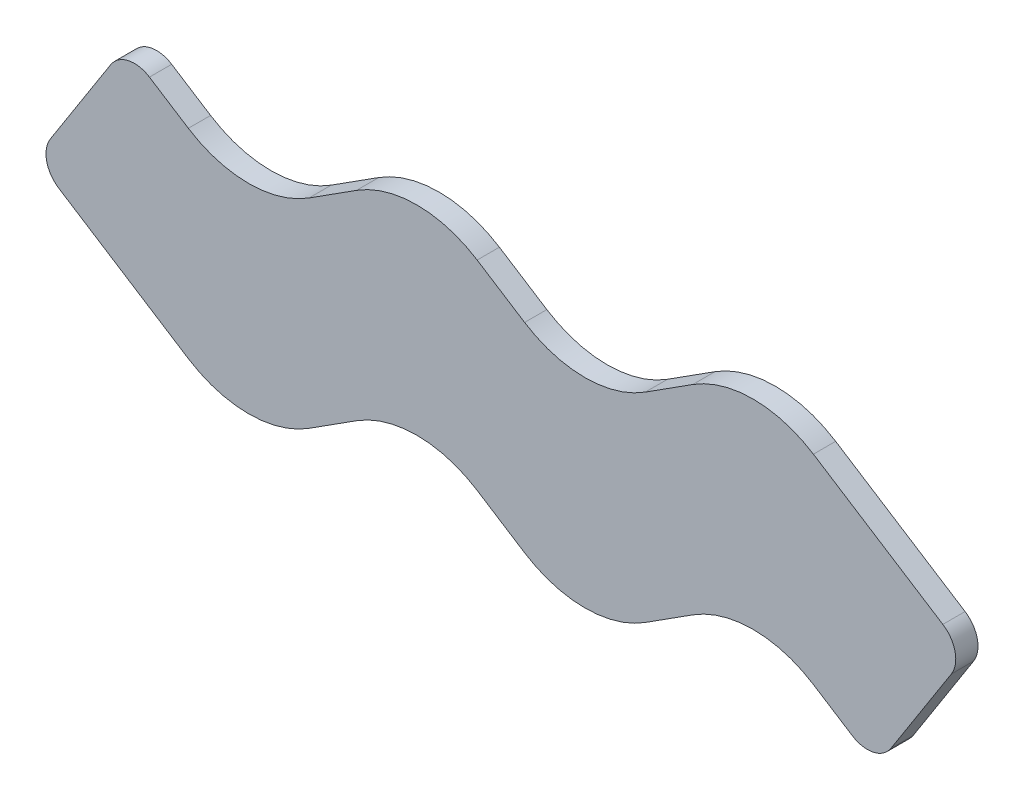
ISO-10303-21;
HEADER;
FILE_DESCRIPTION(('STEP AP214'),'2;1');
FILE_NAME('part.step','',(''),(''),'','','');
FILE_SCHEMA(('AUTOMOTIVE_DESIGN { 1 0 10303 214 1 1 1 1 }'));
ENDSEC;
DATA;
#1=APPLICATION_CONTEXT('core data for automotive mechanical design processes');
#2=APPLICATION_PROTOCOL_DEFINITION('international standard','automotive_design',2000,#1);
#3=PRODUCT_CONTEXT('',#1,'mechanical');
#4=PRODUCT('Part','Part','',(#3));
#5=PRODUCT_RELATED_PRODUCT_CATEGORY('part','',(#4));
#6=PRODUCT_DEFINITION_FORMATION('','',#4);
#7=PRODUCT_DEFINITION_CONTEXT('part definition',#1,'design');
#8=PRODUCT_DEFINITION('design','',#6,#7);
#9=PRODUCT_DEFINITION_SHAPE('','',#8);
#10=(LENGTH_UNIT() NAMED_UNIT(*) SI_UNIT(.MILLI.,.METRE.));
#11=(NAMED_UNIT(*) PLANE_ANGLE_UNIT() SI_UNIT($,.RADIAN.));
#12=(NAMED_UNIT(*) SI_UNIT($,.STERADIAN.) SOLID_ANGLE_UNIT());
#13=UNCERTAINTY_MEASURE_WITH_UNIT(LENGTH_MEASURE(1.E-05),#10,'distance_accuracy_value','');
#14=(GEOMETRIC_REPRESENTATION_CONTEXT(3) GLOBAL_UNCERTAINTY_ASSIGNED_CONTEXT((#13)) GLOBAL_UNIT_ASSIGNED_CONTEXT((#10,
#11,#12)) REPRESENTATION_CONTEXT('',''));
#15=CARTESIAN_POINT('',(0.,0.,0.));
#16=DIRECTION('',(0.,0.,1.));
#17=DIRECTION('',(1.,0.,0.));
#18=AXIS2_PLACEMENT_3D('',#15,#16,#17);
#19=CARTESIAN_POINT('',(8.42171922425703,-13.1818213944893,1.5875));
#20=DIRECTION('',(-0.5383892771022,0.84269625981214,0.));
#21=DIRECTION('',(-0.84269625981214,-0.5383892771022,0.));
#22=AXIS2_PLACEMENT_3D('',#19,#20,#21);
#23=PLANE('',#22);
#24=DIRECTION('',(0.84269625981214,0.5383892771022,0.));
#25=VECTOR('',#24,1.);
#26=CARTESIAN_POINT('',(8.42171922425703,-13.1818213944893,0.));
#27=LINE('',#26,#25);
#28=CARTESIAN_POINT('',(51.0821142168176,14.0734309618689,0.));
#29=VERTEX_POINT('',#28);
#30=CARTESIAN_POINT('',(54.4678857831824,16.2365627959353,0.));
#31=VERTEX_POINT('',#30);
#32=EDGE_CURVE('E400',#29,#31,#27,.T.);
#33=ORIENTED_EDGE('',*,*,#32,.T.);
#34=DIRECTION('',(0.,0.,-1.));
#35=VECTOR('',#34,1.);
#36=CARTESIAN_POINT('',(54.4678857831824,16.2365627959353,1.5875));
#37=LINE('',#36,#35);
#38=CARTESIAN_POINT('',(54.4678857831824,16.2365627959353,1.5875));
#39=VERTEX_POINT('',#38);
#40=EDGE_CURVE('E310',#31,#39,#37,.F.);
#41=ORIENTED_EDGE('',*,*,#40,.T.);
#42=DIRECTION('',(0.84269625981214,0.5383892771022,0.));
#43=VECTOR('',#42,1.);
#44=CARTESIAN_POINT('',(8.42171922425703,-13.1818213944893,1.5875));
#45=LINE('',#44,#43);
#46=CARTESIAN_POINT('',(51.0821142168176,14.0734309618689,1.5875));
#47=VERTEX_POINT('',#46);
#48=EDGE_CURVE('E376',#47,#39,#45,.T.);
#49=ORIENTED_EDGE('',*,*,#48,.F.);
#50=DIRECTION('',(0.,0.,-1.));
#51=VECTOR('',#50,1.);
#52=CARTESIAN_POINT('',(51.0821142168176,14.0734309618689,0.));
#53=LINE('',#52,#51);
#54=EDGE_CURVE('E291',#47,#29,#53,.T.);
#55=ORIENTED_EDGE('',*,*,#54,.T.);
#56=EDGE_LOOP('',(#33,#41,#49,#55));
#57=FACE_BOUND('',#56,.T.);
#58=ADVANCED_FACE('F41',(#57),#23,.F.);
#59=CARTESIAN_POINT('',(25.651678036017,40.1504525781135,1.5875));
#60=DIRECTION('',(0.538389277102201,0.84269625981214,0.));
#61=DIRECTION('',(-0.84269625981214,0.538389277102201,0.));
#62=AXIS2_PLACEMENT_3D('',#59,#60,#61);
#63=PLANE('',#62);
#64=DIRECTION('',(0.84269625981214,-0.538389277102201,0.));
#65=VECTOR('',#64,1.);
#66=CARTESIAN_POINT('',(25.651678036017,40.1504525781135,1.5875));
#67=LINE('',#66,#65);
#68=CARTESIAN_POINT('',(63.0821142168176,16.2365627959352,1.5875));
#69=VERTEX_POINT('',#68);
#70=CARTESIAN_POINT('',(65.8592718177625,14.4622676619982,1.5875));
#71=VERTEX_POINT('',#70);
#72=EDGE_CURVE('E379',#69,#71,#67,.T.);
#73=ORIENTED_EDGE('',*,*,#72,.F.);
#74=DIRECTION('',(0.,0.,-1.));
#75=VECTOR('',#74,1.);
#76=CARTESIAN_POINT('',(63.0821142168176,16.2365627959353,0.));
#77=LINE('',#76,#75);
#78=CARTESIAN_POINT('',(63.0821142168176,16.2365627959352,0.));
#79=VERTEX_POINT('',#78);
#80=EDGE_CURVE('E307',#69,#79,#77,.T.);
#81=ORIENTED_EDGE('',*,*,#80,.T.);
#82=DIRECTION('',(0.84269625981214,-0.538389277102201,0.));
#83=VECTOR('',#82,1.);
#84=CARTESIAN_POINT('',(25.651678036017,40.1504525781135,0.));
#85=LINE('',#84,#83);
#86=CARTESIAN_POINT('',(65.8592718177625,14.4622676619982,0.));
#87=VERTEX_POINT('',#86);
#88=EDGE_CURVE('E403',#79,#87,#85,.T.);
#89=ORIENTED_EDGE('',*,*,#88,.T.);
#90=DIRECTION('',(0.,0.,-1.));
#91=VECTOR('',#90,1.);
#92=CARTESIAN_POINT('',(65.8592718177625,14.4622676619982,1.5875));
#93=LINE('',#92,#91);
#94=EDGE_CURVE('E261',#87,#71,#93,.F.);
#95=ORIENTED_EDGE('',*,*,#94,.T.);
#96=EDGE_LOOP('',(#73,#81,#89,#95));
#97=FACE_BOUND('',#96,.T.);
#98=ADVANCED_FACE('F425',(#97),#63,.F.);
#99=CARTESIAN_POINT('',(41.8929863013699,-26.7649634703196,1.5875));
#100=DIRECTION('',(-0.84269625981214,0.5383892771022,0.));
#101=DIRECTION('',(-0.5383892771022,-0.84269625981214,0.));
#102=AXIS2_PLACEMENT_3D('',#99,#100,#101);
#103=PLANE('',#102);
#104=DIRECTION('',(0.5383892771022,0.84269625981214,0.));
#105=VECTOR('',#104,1.);
#106=CARTESIAN_POINT('',(41.8929863013699,-26.7649634703196,1.5875));
#107=LINE('',#106,#105);
#108=CARTESIAN_POINT('',(68.6214428915912,15.0708816274181,1.5875));
#109=VERTEX_POINT('',#108);
#110=CARTESIAN_POINT('',(72.9285571084088,21.8124517059152,1.5875));
#111=VERTEX_POINT('',#110);
#112=EDGE_CURVE('E383',#109,#111,#107,.T.);
#113=ORIENTED_EDGE('',*,*,#112,.F.);
#114=DIRECTION('',(0.,0.,-1.));
#115=VECTOR('',#114,1.);
#116=CARTESIAN_POINT('',(68.6214428915912,15.0708816274181,1.5875));
#117=LINE('',#116,#115);
#118=CARTESIAN_POINT('',(68.6214428915912,15.0708816274181,0.));
#119=VERTEX_POINT('',#118);
#120=EDGE_CURVE('E258',#109,#119,#117,.T.);
#121=ORIENTED_EDGE('',*,*,#120,.T.);
#122=DIRECTION('',(0.5383892771022,0.84269625981214,0.));
#123=VECTOR('',#122,1.);
#124=CARTESIAN_POINT('',(41.8929863013699,-26.7649634703196,0.));
#125=LINE('',#124,#123);
#126=CARTESIAN_POINT('',(72.9285571084088,21.8124517059152,0.));
#127=VERTEX_POINT('',#126);
#128=EDGE_CURVE('E366',#119,#127,#125,.T.);
#129=ORIENTED_EDGE('',*,*,#128,.T.);
#130=DIRECTION('',(0.,0.,-1.));
#131=VECTOR('',#130,1.);
#132=CARTESIAN_POINT('',(72.9285571084088,21.8124517059152,1.5875));
#133=LINE('',#132,#131);
#134=EDGE_CURVE('E256',#127,#111,#133,.F.);
#135=ORIENTED_EDGE('',*,*,#134,.T.);
#136=EDGE_LOOP('',(#113,#121,#129,#135));
#137=FACE_BOUND('',#136,.T.);
#138=ADVANCED_FACE('F409',(#137),#103,.F.);
#139=CARTESIAN_POINT('',(32.1123493612434,50.2628076958591,1.5875));
#140=DIRECTION('',(0.538389277102201,0.84269625981214,0.));
#141=DIRECTION('',(-0.84269625981214,0.538389277102201,0.));
#142=AXIS2_PLACEMENT_3D('',#139,#140,#141);
#143=PLANE('',#142);
#144=DIRECTION('',(0.84269625981214,-0.538389277102201,0.));
#145=VECTOR('',#144,1.);
#146=CARTESIAN_POINT('',(32.1123493612434,50.2628076958591,0.));
#147=LINE('',#146,#145);
#148=CARTESIAN_POINT('',(63.0821142168176,30.4765690381311,0.));
#149=VERTEX_POINT('',#148);
#150=CARTESIAN_POINT('',(72.3199431429889,24.5746227797439,0.));
#151=VERTEX_POINT('',#150);
#152=EDGE_CURVE('E362',#149,#151,#147,.T.);
#153=ORIENTED_EDGE('',*,*,#152,.F.);
#154=DIRECTION('',(0.,0.,-1.));
#155=VECTOR('',#154,1.);
#156=CARTESIAN_POINT('',(63.0821142168176,30.4765690381311,1.5875));
#157=LINE('',#156,#155);
#158=CARTESIAN_POINT('',(63.0821142168176,30.4765690381311,1.5875));
#159=VERTEX_POINT('',#158);
#160=EDGE_CURVE('E279',#149,#159,#157,.F.);
#161=ORIENTED_EDGE('',*,*,#160,.T.);
#162=DIRECTION('',(0.84269625981214,-0.538389277102201,0.));
#163=VECTOR('',#162,1.);
#164=CARTESIAN_POINT('',(32.1123493612434,50.2628076958591,1.5875));
#165=LINE('',#164,#163);
#166=CARTESIAN_POINT('',(72.3199431429889,24.5746227797439,1.5875));
#167=VERTEX_POINT('',#166);
#168=EDGE_CURVE('E388',#159,#167,#165,.T.);
#169=ORIENTED_EDGE('',*,*,#168,.T.);
#170=DIRECTION('',(0.,0.,-1.));
#171=VECTOR('',#170,1.);
#172=CARTESIAN_POINT('',(72.3199431429889,24.5746227797439,0.));
#173=LINE('',#172,#171);
#174=EDGE_CURVE('E264',#167,#151,#173,.T.);
#175=ORIENTED_EDGE('',*,*,#174,.T.);
#176=EDGE_LOOP('',(#153,#161,#169,#175));
#177=FACE_BOUND('',#176,.T.);
#178=ADVANCED_FACE('F502',(#177),#143,.T.);
#179=CARTESIAN_POINT('',(1.96104789903067,-3.06946627674365,1.5875));
#180=DIRECTION('',(-0.538389277102202,0.84269625981214,0.));
#181=DIRECTION('',(-0.84269625981214,-0.538389277102202,0.));
#182=AXIS2_PLACEMENT_3D('',#179,#180,#181);
#183=PLANE('',#182);
#184=DIRECTION('',(0.842696259812139,0.538389277102201,0.));
#185=VECTOR('',#184,1.);
#186=CARTESIAN_POINT('',(1.96104789903067,-3.06946627674365,0.));
#187=LINE('',#186,#185);
#188=CARTESIAN_POINT('',(51.0821142168176,28.3134372040647,0.));
#189=VERTEX_POINT('',#188);
#190=CARTESIAN_POINT('',(54.4678857831824,30.4765690381311,0.));
#191=VERTEX_POINT('',#190);
#192=EDGE_CURVE('E356',#189,#191,#187,.T.);
#193=ORIENTED_EDGE('',*,*,#192,.F.);
#194=DIRECTION('',(0.,0.,-1.));
#195=VECTOR('',#194,1.);
#196=CARTESIAN_POINT('',(51.0821142168176,28.3134372040647,1.5875));
#197=LINE('',#196,#195);
#198=CARTESIAN_POINT('',(51.0821142168176,28.3134372040647,1.5875));
#199=VERTEX_POINT('',#198);
#200=EDGE_CURVE('E320',#189,#199,#197,.F.);
#201=ORIENTED_EDGE('',*,*,#200,.T.);
#202=DIRECTION('',(0.842696259812139,0.538389277102201,0.));
#203=VECTOR('',#202,1.);
#204=CARTESIAN_POINT('',(1.96104789903067,-3.06946627674365,1.5875));
#205=LINE('',#204,#203);
#206=CARTESIAN_POINT('',(54.4678857831824,30.4765690381311,1.5875));
#207=VERTEX_POINT('',#206);
#208=EDGE_CURVE('E344',#199,#207,#205,.T.);
#209=ORIENTED_EDGE('',*,*,#208,.T.);
#210=DIRECTION('',(0.,0.,-1.));
#211=VECTOR('',#210,1.);
#212=CARTESIAN_POINT('',(54.4678857831824,30.4765690381311,1.5875));
#213=LINE('',#212,#211);
#214=EDGE_CURVE('E267',#207,#191,#213,.T.);
#215=ORIENTED_EDGE('',*,*,#214,.T.);
#216=EDGE_LOOP('',(#193,#201,#209,#215));
#217=FACE_BOUND('',#216,.T.);
#218=ADVANCED_FACE('F360',(#217),#183,.T.);
#219=CARTESIAN_POINT('',(25.1556370324762,39.3740405725715,1.5875));
#220=DIRECTION('',(-0.538389277102201,-0.84269625981214,0.));
#221=DIRECTION('',(0.84269625981214,-0.538389277102201,0.));
#222=AXIS2_PLACEMENT_3D('',#219,#220,#221);
#223=PLANE('',#222);
#224=DIRECTION('',(-0.84269625981214,0.538389277102201,0.));
#225=VECTOR('',#224,1.);
#226=CARTESIAN_POINT('',(25.1556370324762,39.3740405725715,1.5875));
#227=LINE('',#226,#225);
#228=CARTESIAN_POINT('',(42.4678857831824,28.3134372040647,1.5875));
#229=VERTEX_POINT('',#228);
#230=CARTESIAN_POINT('',(39.0821142168176,30.4765690381311,1.5875));
#231=VERTEX_POINT('',#230);
#232=EDGE_CURVE('E343',#229,#231,#227,.T.);
#233=ORIENTED_EDGE('',*,*,#232,.F.);
#234=DIRECTION('',(0.,0.,-1.));
#235=VECTOR('',#234,1.);
#236=CARTESIAN_POINT('',(42.4678857831824,28.3134372040647,1.5875));
#237=LINE('',#236,#235);
#238=CARTESIAN_POINT('',(42.4678857831824,28.3134372040647,0.));
#239=VERTEX_POINT('',#238);
#240=EDGE_CURVE('E317',#229,#239,#237,.T.);
#241=ORIENTED_EDGE('',*,*,#240,.T.);
#242=DIRECTION('',(-0.84269625981214,0.538389277102201,0.));
#243=VECTOR('',#242,1.);
#244=CARTESIAN_POINT('',(25.1556370324762,39.3740405725715,0.));
#245=LINE('',#244,#243);
#246=CARTESIAN_POINT('',(39.0821142168176,30.4765690381311,0.));
#247=VERTEX_POINT('',#246);
#248=EDGE_CURVE('E358',#239,#247,#245,.T.);
#249=ORIENTED_EDGE('',*,*,#248,.T.);
#250=DIRECTION('',(0.,0.,-1.));
#251=VECTOR('',#250,1.);
#252=CARTESIAN_POINT('',(39.0821142168176,30.4765690381311,1.5875));
#253=LINE('',#252,#251);
#254=EDGE_CURVE('E299',#247,#231,#253,.F.);
#255=ORIENTED_EDGE('',*,*,#254,.T.);
#256=EDGE_LOOP('',(#233,#241,#249,#255));
#257=FACE_BOUND('',#256,.T.);
#258=ADVANCED_FACE('F349',(#257),#223,.F.);
#259=CARTESIAN_POINT('',(-4.99566442973648,7.81930084654405,1.5875));
#260=DIRECTION('',(0.538389277102201,-0.84269625981214,0.));
#261=DIRECTION('',(0.84269625981214,0.538389277102201,0.));
#262=AXIS2_PLACEMENT_3D('',#259,#260,#261);
#263=PLANE('',#262);
#264=DIRECTION('',(-0.84269625981214,-0.538389277102201,0.));
#265=VECTOR('',#264,1.);
#266=CARTESIAN_POINT('',(-4.99566442973648,7.81930084654405,0.));
#267=LINE('',#266,#265);
#268=CARTESIAN_POINT('',(30.4678857831824,30.4765690381311,0.));
#269=VERTEX_POINT('',#268);
#270=CARTESIAN_POINT('',(27.0821142168176,28.3134372040647,0.));
#271=VERTEX_POINT('',#270);
#272=EDGE_CURVE('E364',#269,#271,#267,.T.);
#273=ORIENTED_EDGE('',*,*,#272,.T.);
#274=DIRECTION('',(0.,0.,-1.));
#275=VECTOR('',#274,1.);
#276=CARTESIAN_POINT('',(27.0821142168176,28.3134372040647,1.5875));
#277=LINE('',#276,#275);
#278=CARTESIAN_POINT('',(27.0821142168176,28.3134372040647,1.5875));
#279=VERTEX_POINT('',#278);
#280=EDGE_CURVE('E62',#271,#279,#277,.F.);
#281=ORIENTED_EDGE('',*,*,#280,.T.);
#282=DIRECTION('',(-0.84269625981214,-0.538389277102201,0.));
#283=VECTOR('',#282,1.);
#284=CARTESIAN_POINT('',(-4.99566442973648,7.81930084654405,1.5875));
#285=LINE('',#284,#283);
#286=CARTESIAN_POINT('',(30.4678857831824,30.4765690381311,1.5875));
#287=VERTEX_POINT('',#286);
#288=EDGE_CURVE('E352',#287,#279,#285,.T.);
#289=ORIENTED_EDGE('',*,*,#288,.F.);
#290=DIRECTION('',(0.,0.,-1.));
#291=VECTOR('',#290,1.);
#292=CARTESIAN_POINT('',(30.4678857831824,30.4765690381311,1.5875));
#293=LINE('',#292,#291);
#294=EDGE_CURVE('E296',#287,#269,#293,.T.);
#295=ORIENTED_EDGE('',*,*,#294,.T.);
#296=EDGE_LOOP('',(#273,#281,#289,#295));
#297=FACE_BOUND('',#296,.T.);
#298=ADVANCED_FACE('F467',(#297),#263,.F.);
#299=CARTESIAN_POINT('',(18.1989247037092,28.4852734492838,1.5875));
#300=DIRECTION('',(0.538389277102202,0.842696259812139,0.));
#301=DIRECTION('',(-0.842696259812139,0.538389277102202,0.));
#302=AXIS2_PLACEMENT_3D('',#299,#300,#301);
#303=PLANE('',#302);
#304=DIRECTION('',(0.842696259812139,-0.538389277102202,0.));
#305=VECTOR('',#304,1.);
#306=CARTESIAN_POINT('',(18.1989247037092,28.4852734492838,1.5875));
#307=LINE('',#306,#305);
#308=CARTESIAN_POINT('',(15.6907281822375,30.0877323380018,1.5875));
#309=VERTEX_POINT('',#308);
#310=CARTESIAN_POINT('',(18.4678857831824,28.3134372040648,1.5875));
#311=VERTEX_POINT('',#310);
#312=EDGE_CURVE('E392',#309,#311,#307,.T.);
#313=ORIENTED_EDGE('',*,*,#312,.T.);
#314=DIRECTION('',(0.,0.,-1.));
#315=VECTOR('',#314,1.);
#316=CARTESIAN_POINT('',(18.4678857831824,28.3134372040648,1.5875));
#317=LINE('',#316,#315);
#318=CARTESIAN_POINT('',(18.4678857831824,28.3134372040648,0.));
#319=VERTEX_POINT('',#318);
#320=EDGE_CURVE('E322',#311,#319,#317,.T.);
#321=ORIENTED_EDGE('',*,*,#320,.T.);
#322=DIRECTION('',(0.842696259812139,-0.538389277102202,0.));
#323=VECTOR('',#322,1.);
#324=CARTESIAN_POINT('',(18.1989247037092,28.4852734492838,0.));
#325=LINE('',#324,#323);
#326=CARTESIAN_POINT('',(15.6907281822375,30.0877323380018,0.));
#327=VERTEX_POINT('',#326);
#328=EDGE_CURVE('E223',#327,#319,#325,.T.);
#329=ORIENTED_EDGE('',*,*,#328,.F.);
#330=DIRECTION('',(0.,0.,-1.));
#331=VECTOR('',#330,1.);
#332=CARTESIAN_POINT('',(15.6907281822375,30.0877323380018,1.5875));
#333=LINE('',#332,#331);
#334=EDGE_CURVE('E244',#327,#309,#333,.F.);
#335=ORIENTED_EDGE('',*,*,#334,.T.);
#336=EDGE_LOOP('',(#313,#321,#329,#335));
#337=FACE_BOUND('',#336,.T.);
#338=ADVANCED_FACE('F462',(#337),#303,.T.);
#339=CARTESIAN_POINT('',(-4.19358904109588,2.67923744292237,1.5875));
#340=DIRECTION('',(-0.84269625981214,0.5383892771022,0.));
#341=DIRECTION('',(-0.5383892771022,-0.84269625981214,0.));
#342=AXIS2_PLACEMENT_3D('',#339,#340,#341);
#343=PLANE('',#342);
#344=DIRECTION('',(0.5383892771022,0.84269625981214,0.));
#345=VECTOR('',#344,1.);
#346=CARTESIAN_POINT('',(-4.19358904109588,2.67923744292237,1.5875));
#347=LINE('',#346,#345);
#348=CARTESIAN_POINT('',(8.6214428915912,22.7375482940848,1.5875));
#349=VERTEX_POINT('',#348);
#350=CARTESIAN_POINT('',(12.9285571084088,29.4791183725819,1.5875));
#351=VERTEX_POINT('',#350);
#352=EDGE_CURVE('E395',#349,#351,#347,.T.);
#353=ORIENTED_EDGE('',*,*,#352,.T.);
#354=DIRECTION('',(0.,0.,-1.));
#355=VECTOR('',#354,1.);
#356=CARTESIAN_POINT('',(12.9285571084088,29.4791183725819,1.5875));
#357=LINE('',#356,#355);
#358=CARTESIAN_POINT('',(12.9285571084088,29.4791183725819,0.));
#359=VERTEX_POINT('',#358);
#360=EDGE_CURVE('E222',#351,#359,#357,.T.);
#361=ORIENTED_EDGE('',*,*,#360,.T.);
#362=DIRECTION('',(0.5383892771022,0.84269625981214,0.));
#363=VECTOR('',#362,1.);
#364=CARTESIAN_POINT('',(-4.19358904109588,2.67923744292237,0.));
#365=LINE('',#364,#363);
#366=CARTESIAN_POINT('',(8.6214428915912,22.7375482940848,0.));
#367=VERTEX_POINT('',#366);
#368=EDGE_CURVE('E205',#367,#359,#365,.T.);
#369=ORIENTED_EDGE('',*,*,#368,.F.);
#370=DIRECTION('',(0.,0.,-1.));
#371=VECTOR('',#370,1.);
#372=CARTESIAN_POINT('',(8.6214428915912,22.7375482940848,1.5875));
#373=LINE('',#372,#371);
#374=EDGE_CURVE('E219',#367,#349,#373,.F.);
#375=ORIENTED_EDGE('',*,*,#374,.T.);
#376=EDGE_LOOP('',(#353,#361,#369,#375));
#377=FACE_BOUND('',#376,.T.);
#378=ADVANCED_FACE('F218',(#377),#343,.T.);
#379=CARTESIAN_POINT('',(11.7382533784827,18.3729183315381,1.5875));
#380=DIRECTION('',(-0.5383892771022,-0.84269625981214,0.));
#381=DIRECTION('',(0.84269625981214,-0.5383892771022,0.));
#382=AXIS2_PLACEMENT_3D('',#379,#380,#381);
#383=PLANE('',#382);
#384=DIRECTION('',(-0.84269625981214,0.5383892771022,0.));
#385=VECTOR('',#384,1.);
#386=CARTESIAN_POINT('',(11.7382533784827,18.3729183315381,0.));
#387=LINE('',#386,#385);
#388=CARTESIAN_POINT('',(18.4678857831824,14.0734309618689,0.));
#389=VERTEX_POINT('',#388);
#390=CARTESIAN_POINT('',(9.23005685701108,19.9753772202561,0.));
#391=VERTEX_POINT('',#390);
#392=EDGE_CURVE('E207',#389,#391,#387,.T.);
#393=ORIENTED_EDGE('',*,*,#392,.F.);
#394=DIRECTION('',(0.,0.,-1.));
#395=VECTOR('',#394,1.);
#396=CARTESIAN_POINT('',(18.4678857831824,14.0734309618689,1.5875));
#397=LINE('',#396,#395);
#398=CARTESIAN_POINT('',(18.4678857831824,14.0734309618689,1.5875));
#399=VERTEX_POINT('',#398);
#400=EDGE_CURVE('E305',#389,#399,#397,.F.);
#401=ORIENTED_EDGE('',*,*,#400,.T.);
#402=DIRECTION('',(-0.84269625981214,0.5383892771022,0.));
#403=VECTOR('',#402,1.);
#404=CARTESIAN_POINT('',(11.7382533784827,18.3729183315381,1.5875));
#405=LINE('',#404,#403);
#406=CARTESIAN_POINT('',(9.23005685701108,19.9753772202561,1.5875));
#407=VERTEX_POINT('',#406);
#408=EDGE_CURVE('E397',#399,#407,#405,.T.);
#409=ORIENTED_EDGE('',*,*,#408,.T.);
#410=DIRECTION('',(0.,0.,-1.));
#411=VECTOR('',#410,1.);
#412=CARTESIAN_POINT('',(9.23005685701108,19.9753772202561,1.5875));
#413=LINE('',#412,#411);
#414=EDGE_CURVE('E254',#407,#391,#413,.T.);
#415=ORIENTED_EDGE('',*,*,#414,.T.);
#416=EDGE_LOOP('',(#393,#401,#409,#415));
#417=FACE_BOUND('',#416,.T.);
#418=ADVANCED_FACE('F453',(#417),#383,.T.);
#419=CARTESIAN_POINT('',(1.46500689548992,-2.29305427120162,1.5875));
#420=DIRECTION('',(0.538389277102201,-0.84269625981214,0.));
#421=DIRECTION('',(0.84269625981214,0.538389277102201,0.));
#422=AXIS2_PLACEMENT_3D('',#419,#420,#421);
#423=PLANE('',#422);
#424=DIRECTION('',(-0.84269625981214,-0.538389277102201,0.));
#425=VECTOR('',#424,1.);
#426=CARTESIAN_POINT('',(1.46500689548992,-2.29305427120162,0.));
#427=LINE('',#426,#425);
#428=CARTESIAN_POINT('',(30.4678857831824,16.2365627959352,0.));
#429=VERTEX_POINT('',#428);
#430=CARTESIAN_POINT('',(27.0821142168176,14.0734309618689,0.));
#431=VERTEX_POINT('',#430);
#432=EDGE_CURVE('E372',#429,#431,#427,.T.);
#433=ORIENTED_EDGE('',*,*,#432,.F.);
#434=DIRECTION('',(0.,0.,-1.));
#435=VECTOR('',#434,1.);
#436=CARTESIAN_POINT('',(30.4678857831824,16.2365627959352,1.5875));
#437=LINE('',#436,#435);
#438=CARTESIAN_POINT('',(30.4678857831824,16.2365627959352,1.5875));
#439=VERTEX_POINT('',#438);
#440=EDGE_CURVE('E315',#429,#439,#437,.F.);
#441=ORIENTED_EDGE('',*,*,#440,.T.);
#442=DIRECTION('',(-0.84269625981214,-0.538389277102201,0.));
#443=VECTOR('',#442,1.);
#444=CARTESIAN_POINT('',(1.46500689548992,-2.29305427120162,1.5875));
#445=LINE('',#444,#443);
#446=CARTESIAN_POINT('',(27.0821142168176,14.0734309618689,1.5875));
#447=VERTEX_POINT('',#446);
#448=EDGE_CURVE('E234',#439,#447,#445,.T.);
#449=ORIENTED_EDGE('',*,*,#448,.T.);
#450=DIRECTION('',(0.,0.,-1.));
#451=VECTOR('',#450,1.);
#452=CARTESIAN_POINT('',(27.0821142168176,14.0734309618689,1.5875));
#453=LINE('',#452,#451);
#454=EDGE_CURVE('E302',#447,#431,#453,.T.);
#455=ORIENTED_EDGE('',*,*,#454,.T.);
#456=EDGE_LOOP('',(#433,#441,#449,#455));
#457=FACE_BOUND('',#456,.T.);
#458=ADVANCED_FACE('F446',(#457),#423,.T.);
#459=CARTESIAN_POINT('',(18.6949657072498,29.2616854548258,1.5875));
#460=DIRECTION('',(-0.538389277102201,-0.84269625981214,0.));
#461=DIRECTION('',(0.84269625981214,-0.538389277102201,0.));
#462=AXIS2_PLACEMENT_3D('',#459,#460,#461);
#463=PLANE('',#462);
#464=DIRECTION('',(-0.84269625981214,0.538389277102201,0.));
#465=VECTOR('',#464,1.);
#466=CARTESIAN_POINT('',(18.6949657072498,29.2616854548258,1.5875));
#467=LINE('',#466,#465);
#468=CARTESIAN_POINT('',(42.4678857831824,14.0734309618688,1.5875));
#469=VERTEX_POINT('',#468);
#470=CARTESIAN_POINT('',(39.0821142168176,16.2365627959352,1.5875));
#471=VERTEX_POINT('',#470);
#472=EDGE_CURVE('E229',#469,#471,#467,.T.);
#473=ORIENTED_EDGE('',*,*,#472,.T.);
#474=DIRECTION('',(0.,0.,-1.));
#475=VECTOR('',#474,1.);
#476=CARTESIAN_POINT('',(39.0821142168176,16.2365627959352,0.));
#477=LINE('',#476,#475);
#478=CARTESIAN_POINT('',(39.0821142168176,16.2365627959352,0.));
#479=VERTEX_POINT('',#478);
#480=EDGE_CURVE('E312',#471,#479,#477,.T.);
#481=ORIENTED_EDGE('',*,*,#480,.T.);
#482=DIRECTION('',(-0.84269625981214,0.538389277102201,0.));
#483=VECTOR('',#482,1.);
#484=CARTESIAN_POINT('',(18.6949657072498,29.2616854548258,0.));
#485=LINE('',#484,#483);
#486=CARTESIAN_POINT('',(42.4678857831824,14.0734309618688,0.));
#487=VERTEX_POINT('',#486);
#488=EDGE_CURVE('E237',#487,#479,#485,.T.);
#489=ORIENTED_EDGE('',*,*,#488,.F.);
#490=DIRECTION('',(0.,0.,-1.));
#491=VECTOR('',#490,1.);
#492=CARTESIAN_POINT('',(42.4678857831824,14.0734309618688,1.5875));
#493=LINE('',#492,#491);
#494=EDGE_CURVE('E294',#487,#469,#493,.F.);
#495=ORIENTED_EDGE('',*,*,#494,.T.);
#496=EDGE_LOOP('',(#473,#481,#489,#495));
#497=FACE_BOUND('',#496,.T.);
#498=ADVANCED_FACE('F435',(#497),#463,.T.);
#499=CARTESIAN_POINT('',(0.,0.,1.5875));
#500=DIRECTION('',(0.,0.,1.));
#501=DIRECTION('',(1.,0.,0.));
#502=AXIS2_PLACEMENT_3D('',#499,#500,#501);
#503=PLANE('',#502);
#504=ORIENTED_EDGE('',*,*,#168,.F.);
#505=CARTESIAN_POINT('',(58.775,23.734998959634,1.5875));
#506=DIRECTION('',(0.,0.,1.));
#507=DIRECTION('',(1.,0.,0.));
#508=AXIS2_PLACEMENT_3D('',#505,#506,#507);
#509=CIRCLE('',#508,8.);
#510=EDGE_CURVE('E288',#159,#207,#509,.T.);
#511=ORIENTED_EDGE('',*,*,#510,.T.);
#512=ORIENTED_EDGE('',*,*,#208,.F.);
#513=CARTESIAN_POINT('',(46.775,35.0550072825619,1.5875));
#514=DIRECTION('',(0.,0.,1.));
#515=DIRECTION('',(1.,0.,0.));
#516=AXIS2_PLACEMENT_3D('',#513,#514,#515);
#517=CIRCLE('',#516,8.);
#518=EDGE_CURVE('E336',#199,#229,#517,.F.);
#519=ORIENTED_EDGE('',*,*,#518,.T.);
#520=ORIENTED_EDGE('',*,*,#232,.T.);
#521=CARTESIAN_POINT('',(34.775,23.734998959634,1.5875));
#522=DIRECTION('',(0.,0.,1.));
#523=DIRECTION('',(1.,0.,0.));
#524=AXIS2_PLACEMENT_3D('',#521,#522,#523);
#525=CIRCLE('',#524,8.);
#526=EDGE_CURVE('E284',#231,#287,#525,.T.);
#527=ORIENTED_EDGE('',*,*,#526,.T.);
#528=ORIENTED_EDGE('',*,*,#288,.T.);
#529=CARTESIAN_POINT('',(22.775,35.0550072825619,1.5875));
#530=DIRECTION('',(0.,0.,1.));
#531=DIRECTION('',(1.,0.,0.));
#532=AXIS2_PLACEMENT_3D('',#529,#530,#531);
#533=CIRCLE('',#532,8.);
#534=EDGE_CURVE('E11',#279,#311,#533,.F.);
#535=ORIENTED_EDGE('',*,*,#534,.T.);
#536=ORIENTED_EDGE('',*,*,#312,.F.);
#537=CARTESIAN_POINT('',(14.6139496280331,28.4023398183775,1.5875));
#538=DIRECTION('',(0.,0.,1.));
#539=DIRECTION('',(1.,0.,0.));
#540=AXIS2_PLACEMENT_3D('',#537,#538,#539);
#541=CIRCLE('',#540,2.);
#542=EDGE_CURVE('E252',#309,#351,#541,.T.);
#543=ORIENTED_EDGE('',*,*,#542,.T.);
#544=ORIENTED_EDGE('',*,*,#352,.F.);
#545=CARTESIAN_POINT('',(10.3068354112155,21.6607697398804,1.5875));
#546=DIRECTION('',(0.,0.,1.));
#547=DIRECTION('',(1.,0.,0.));
#548=AXIS2_PLACEMENT_3D('',#545,#546,#547);
#549=CIRCLE('',#548,2.);
#550=EDGE_CURVE('E228',#349,#407,#549,.T.);
#551=ORIENTED_EDGE('',*,*,#550,.T.);
#552=ORIENTED_EDGE('',*,*,#408,.F.);
#553=CARTESIAN_POINT('',(22.775,20.815001040366,1.5875));
#554=DIRECTION('',(0.,0.,1.));
#555=DIRECTION('',(1.,0.,0.));
#556=AXIS2_PLACEMENT_3D('',#553,#554,#555);
#557=CIRCLE('',#556,8.);
#558=EDGE_CURVE('E281',#399,#447,#557,.T.);
#559=ORIENTED_EDGE('',*,*,#558,.T.);
#560=ORIENTED_EDGE('',*,*,#448,.F.);
#561=CARTESIAN_POINT('',(34.775,9.49499271743813,1.5875));
#562=DIRECTION('',(0.,0.,1.));
#563=DIRECTION('',(1.,0.,0.));
#564=AXIS2_PLACEMENT_3D('',#561,#562,#563);
#565=CIRCLE('',#564,8.);
#566=EDGE_CURVE('E332',#439,#471,#565,.F.);
#567=ORIENTED_EDGE('',*,*,#566,.T.);
#568=ORIENTED_EDGE('',*,*,#472,.F.);
#569=CARTESIAN_POINT('',(46.775,20.815001040366,1.5875));
#570=DIRECTION('',(0.,0.,1.));
#571=DIRECTION('',(1.,0.,0.));
#572=AXIS2_PLACEMENT_3D('',#569,#570,#571);
#573=CIRCLE('',#572,8.);
#574=EDGE_CURVE('E286',#469,#47,#573,.T.);
#575=ORIENTED_EDGE('',*,*,#574,.T.);
#576=ORIENTED_EDGE('',*,*,#48,.T.);
#577=CARTESIAN_POINT('',(58.775,9.49499271743813,1.5875));
#578=DIRECTION('',(0.,0.,1.));
#579=DIRECTION('',(1.,0.,0.));
#580=AXIS2_PLACEMENT_3D('',#577,#578,#579);
#581=CIRCLE('',#580,8.);
#582=EDGE_CURVE('E328',#39,#69,#581,.F.);
#583=ORIENTED_EDGE('',*,*,#582,.T.);
#584=ORIENTED_EDGE('',*,*,#72,.T.);
#585=CARTESIAN_POINT('',(66.9360503719669,16.1476601816225,1.5875));
#586=DIRECTION('',(0.,0.,1.));
#587=DIRECTION('',(1.,0.,0.));
#588=AXIS2_PLACEMENT_3D('',#585,#586,#587);
#589=CIRCLE('',#588,2.);
#590=EDGE_CURVE('E249',#71,#109,#589,.T.);
#591=ORIENTED_EDGE('',*,*,#590,.T.);
#592=ORIENTED_EDGE('',*,*,#112,.T.);
#593=CARTESIAN_POINT('',(71.2431645887845,22.8892302601196,1.5875));
#594=DIRECTION('',(0.,0.,1.));
#595=DIRECTION('',(1.,0.,0.));
#596=AXIS2_PLACEMENT_3D('',#593,#594,#595);
#597=CIRCLE('',#596,2.);
#598=EDGE_CURVE('E246',#111,#167,#597,.T.);
#599=ORIENTED_EDGE('',*,*,#598,.T.);
#600=EDGE_LOOP('',(#504,#511,#512,#519,#520,#527,#528,#535,#536,#543,#544,#551,#552,#559,#560,
#567,#568,#575,#576,#583,#584,#591,#592,#599));
#601=FACE_BOUND('',#600,.T.);
#602=ADVANCED_FACE('F342',(#601),#503,.T.);
#603=CARTESIAN_POINT('',(0.,0.,0.));
#604=DIRECTION('',(0.,0.,1.));
#605=DIRECTION('',(1.,0.,0.));
#606=AXIS2_PLACEMENT_3D('',#603,#604,#605);
#607=PLANE('',#606);
#608=ORIENTED_EDGE('',*,*,#248,.F.);
#609=CARTESIAN_POINT('',(46.775,35.0550072825619,0.));
#610=DIRECTION('',(0.,0.,1.));
#611=DIRECTION('',(1.,0.,0.));
#612=AXIS2_PLACEMENT_3D('',#609,#610,#611);
#613=CIRCLE('',#612,8.);
#614=EDGE_CURVE('E334',#239,#189,#613,.T.);
#615=ORIENTED_EDGE('',*,*,#614,.T.);
#616=ORIENTED_EDGE('',*,*,#192,.T.);
#617=CARTESIAN_POINT('',(58.775,23.734998959634,0.));
#618=DIRECTION('',(0.,0.,1.));
#619=DIRECTION('',(1.,0.,0.));
#620=AXIS2_PLACEMENT_3D('',#617,#618,#619);
#621=CIRCLE('',#620,8.);
#622=EDGE_CURVE('E277',#191,#149,#621,.F.);
#623=ORIENTED_EDGE('',*,*,#622,.T.);
#624=ORIENTED_EDGE('',*,*,#152,.T.);
#625=CARTESIAN_POINT('',(71.2431645887845,22.8892302601196,0.));
#626=DIRECTION('',(0.,0.,1.));
#627=DIRECTION('',(1.,0.,0.));
#628=AXIS2_PLACEMENT_3D('',#625,#626,#627);
#629=CIRCLE('',#628,2.);
#630=EDGE_CURVE('E231',#151,#127,#629,.F.);
#631=ORIENTED_EDGE('',*,*,#630,.T.);
#632=ORIENTED_EDGE('',*,*,#128,.F.);
#633=CARTESIAN_POINT('',(66.9360503719669,16.1476601816225,0.));
#634=DIRECTION('',(0.,0.,1.));
#635=DIRECTION('',(1.,0.,0.));
#636=AXIS2_PLACEMENT_3D('',#633,#634,#635);
#637=CIRCLE('',#636,2.);
#638=EDGE_CURVE('E213',#119,#87,#637,.F.);
#639=ORIENTED_EDGE('',*,*,#638,.T.);
#640=ORIENTED_EDGE('',*,*,#88,.F.);
#641=CARTESIAN_POINT('',(58.775,9.49499271743813,0.));
#642=DIRECTION('',(0.,0.,1.));
#643=DIRECTION('',(1.,0.,0.));
#644=AXIS2_PLACEMENT_3D('',#641,#642,#643);
#645=CIRCLE('',#644,8.);
#646=EDGE_CURVE('E326',#79,#31,#645,.T.);
#647=ORIENTED_EDGE('',*,*,#646,.T.);
#648=ORIENTED_EDGE('',*,*,#32,.F.);
#649=CARTESIAN_POINT('',(46.775,20.815001040366,0.));
#650=DIRECTION('',(0.,0.,1.));
#651=DIRECTION('',(1.,0.,0.));
#652=AXIS2_PLACEMENT_3D('',#649,#650,#651);
#653=CIRCLE('',#652,8.);
#654=EDGE_CURVE('E275',#29,#487,#653,.F.);
#655=ORIENTED_EDGE('',*,*,#654,.T.);
#656=ORIENTED_EDGE('',*,*,#488,.T.);
#657=CARTESIAN_POINT('',(34.775,9.49499271743813,0.));
#658=DIRECTION('',(0.,0.,1.));
#659=DIRECTION('',(1.,0.,0.));
#660=AXIS2_PLACEMENT_3D('',#657,#658,#659);
#661=CIRCLE('',#660,8.);
#662=EDGE_CURVE('E330',#479,#429,#661,.T.);
#663=ORIENTED_EDGE('',*,*,#662,.T.);
#664=ORIENTED_EDGE('',*,*,#432,.T.);
#665=CARTESIAN_POINT('',(22.775,20.815001040366,0.));
#666=DIRECTION('',(0.,0.,1.));
#667=DIRECTION('',(1.,0.,0.));
#668=AXIS2_PLACEMENT_3D('',#665,#666,#667);
#669=CIRCLE('',#668,8.);
#670=EDGE_CURVE('E270',#431,#389,#669,.F.);
#671=ORIENTED_EDGE('',*,*,#670,.T.);
#672=ORIENTED_EDGE('',*,*,#392,.T.);
#673=CARTESIAN_POINT('',(10.3068354112155,21.6607697398804,0.));
#674=DIRECTION('',(0.,0.,1.));
#675=DIRECTION('',(1.,0.,0.));
#676=AXIS2_PLACEMENT_3D('',#673,#674,#675);
#677=CIRCLE('',#676,2.);
#678=EDGE_CURVE('E201',#391,#367,#677,.F.);
#679=ORIENTED_EDGE('',*,*,#678,.T.);
#680=ORIENTED_EDGE('',*,*,#368,.T.);
#681=CARTESIAN_POINT('',(14.6139496280331,28.4023398183775,0.));
#682=DIRECTION('',(0.,0.,1.));
#683=DIRECTION('',(1.,0.,0.));
#684=AXIS2_PLACEMENT_3D('',#681,#682,#683);
#685=CIRCLE('',#684,2.);
#686=EDGE_CURVE('E212',#359,#327,#685,.F.);
#687=ORIENTED_EDGE('',*,*,#686,.T.);
#688=ORIENTED_EDGE('',*,*,#328,.T.);
#689=CARTESIAN_POINT('',(22.775,35.0550072825619,0.));
#690=DIRECTION('',(0.,0.,1.));
#691=DIRECTION('',(1.,0.,0.));
#692=AXIS2_PLACEMENT_3D('',#689,#690,#691);
#693=CIRCLE('',#692,8.);
#694=EDGE_CURVE('E49',#319,#271,#693,.T.);
#695=ORIENTED_EDGE('',*,*,#694,.T.);
#696=ORIENTED_EDGE('',*,*,#272,.F.);
#697=CARTESIAN_POINT('',(34.775,23.734998959634,0.));
#698=DIRECTION('',(0.,0.,1.));
#699=DIRECTION('',(1.,0.,0.));
#700=AXIS2_PLACEMENT_3D('',#697,#698,#699);
#701=CIRCLE('',#700,8.);
#702=EDGE_CURVE('E272',#269,#247,#701,.F.);
#703=ORIENTED_EDGE('',*,*,#702,.T.);
#704=EDGE_LOOP('',(#608,#615,#616,#623,#624,#631,#632,#639,#640,#647,#648,#655,#656,#663,#664,
#671,#672,#679,#680,#687,#688,#695,#696,#703));
#705=FACE_BOUND('',#704,.T.);
#706=ADVANCED_FACE('F204',(#705),#607,.F.);
#707=CARTESIAN_POINT('',(14.6139496280331,28.4023398183775,1.5875));
#708=DIRECTION('',(0.,0.,-1.));
#709=DIRECTION('',(-1.,0.,0.));
#710=AXIS2_PLACEMENT_3D('',#707,#708,#709);
#711=CYLINDRICAL_SURFACE('',#710,2.);
#712=ORIENTED_EDGE('',*,*,#542,.F.);
#713=ORIENTED_EDGE('',*,*,#334,.F.);
#714=ORIENTED_EDGE('',*,*,#686,.F.);
#715=ORIENTED_EDGE('',*,*,#360,.F.);
#716=EDGE_LOOP('',(#712,#713,#714,#715));
#717=FACE_BOUND('',#716,.T.);
#718=ADVANCED_FACE('F458',(#717),#711,.T.);
#719=CARTESIAN_POINT('',(10.3068354112155,21.6607697398804,1.5875));
#720=DIRECTION('',(0.,0.,-1.));
#721=DIRECTION('',(-1.,0.,0.));
#722=AXIS2_PLACEMENT_3D('',#719,#720,#721);
#723=CYLINDRICAL_SURFACE('',#722,2.);
#724=ORIENTED_EDGE('',*,*,#550,.F.);
#725=ORIENTED_EDGE('',*,*,#374,.F.);
#726=ORIENTED_EDGE('',*,*,#678,.F.);
#727=ORIENTED_EDGE('',*,*,#414,.F.);
#728=EDGE_LOOP('',(#724,#725,#726,#727));
#729=FACE_BOUND('',#728,.T.);
#730=ADVANCED_FACE('F226',(#729),#723,.T.);
#731=CARTESIAN_POINT('',(66.9360503719669,16.1476601816225,1.5875));
#732=DIRECTION('',(0.,0.,-1.));
#733=DIRECTION('',(-1.,0.,0.));
#734=AXIS2_PLACEMENT_3D('',#731,#732,#733);
#735=CYLINDRICAL_SURFACE('',#734,2.);
#736=ORIENTED_EDGE('',*,*,#590,.F.);
#737=ORIENTED_EDGE('',*,*,#94,.F.);
#738=ORIENTED_EDGE('',*,*,#638,.F.);
#739=ORIENTED_EDGE('',*,*,#120,.F.);
#740=EDGE_LOOP('',(#736,#737,#738,#739));
#741=FACE_BOUND('',#740,.T.);
#742=ADVANCED_FACE('F419',(#741),#735,.T.);
#743=CARTESIAN_POINT('',(71.2431645887845,22.8892302601196,1.5875));
#744=DIRECTION('',(0.,0.,1.));
#745=DIRECTION('',(1.,0.,0.));
#746=AXIS2_PLACEMENT_3D('',#743,#744,#745);
#747=CYLINDRICAL_SURFACE('',#746,2.);
#748=ORIENTED_EDGE('',*,*,#598,.F.);
#749=ORIENTED_EDGE('',*,*,#134,.F.);
#750=ORIENTED_EDGE('',*,*,#630,.F.);
#751=ORIENTED_EDGE('',*,*,#174,.F.);
#752=EDGE_LOOP('',(#748,#749,#750,#751));
#753=FACE_BOUND('',#752,.T.);
#754=ADVANCED_FACE('F414',(#753),#747,.T.);
#755=CARTESIAN_POINT('',(58.775,23.734998959634,1.5875));
#756=DIRECTION('',(0.,0.,-1.));
#757=DIRECTION('',(-1.,0.,0.));
#758=AXIS2_PLACEMENT_3D('',#755,#756,#757);
#759=CYLINDRICAL_SURFACE('',#758,8.);
#760=ORIENTED_EDGE('',*,*,#510,.F.);
#761=ORIENTED_EDGE('',*,*,#160,.F.);
#762=ORIENTED_EDGE('',*,*,#622,.F.);
#763=ORIENTED_EDGE('',*,*,#214,.F.);
#764=EDGE_LOOP('',(#760,#761,#762,#763));
#765=FACE_BOUND('',#764,.T.);
#766=ADVANCED_FACE('F477',(#765),#759,.T.);
#767=CARTESIAN_POINT('',(46.775,20.815001040366,1.5875));
#768=DIRECTION('',(0.,0.,1.));
#769=DIRECTION('',(1.,0.,0.));
#770=AXIS2_PLACEMENT_3D('',#767,#768,#769);
#771=CYLINDRICAL_SURFACE('',#770,8.);
#772=ORIENTED_EDGE('',*,*,#574,.F.);
#773=ORIENTED_EDGE('',*,*,#494,.F.);
#774=ORIENTED_EDGE('',*,*,#654,.F.);
#775=ORIENTED_EDGE('',*,*,#54,.F.);
#776=EDGE_LOOP('',(#772,#773,#774,#775));
#777=FACE_BOUND('',#776,.T.);
#778=ADVANCED_FACE('F439',(#777),#771,.T.);
#779=CARTESIAN_POINT('',(34.775,23.734998959634,1.5875));
#780=DIRECTION('',(0.,0.,-1.));
#781=DIRECTION('',(-1.,0.,0.));
#782=AXIS2_PLACEMENT_3D('',#779,#780,#781);
#783=CYLINDRICAL_SURFACE('',#782,8.);
#784=ORIENTED_EDGE('',*,*,#526,.F.);
#785=ORIENTED_EDGE('',*,*,#254,.F.);
#786=ORIENTED_EDGE('',*,*,#702,.F.);
#787=ORIENTED_EDGE('',*,*,#294,.F.);
#788=EDGE_LOOP('',(#784,#785,#786,#787));
#789=FACE_BOUND('',#788,.T.);
#790=ADVANCED_FACE('F469',(#789),#783,.T.);
#791=CARTESIAN_POINT('',(22.775,20.815001040366,1.5875));
#792=DIRECTION('',(0.,0.,-1.));
#793=DIRECTION('',(-1.,0.,0.));
#794=AXIS2_PLACEMENT_3D('',#791,#792,#793);
#795=CYLINDRICAL_SURFACE('',#794,8.);
#796=ORIENTED_EDGE('',*,*,#558,.F.);
#797=ORIENTED_EDGE('',*,*,#400,.F.);
#798=ORIENTED_EDGE('',*,*,#670,.F.);
#799=ORIENTED_EDGE('',*,*,#454,.F.);
#800=EDGE_LOOP('',(#796,#797,#798,#799));
#801=FACE_BOUND('',#800,.T.);
#802=ADVANCED_FACE('F450',(#801),#795,.T.);
#803=CARTESIAN_POINT('',(58.775,9.49499271743813,1.5875));
#804=DIRECTION('',(0.,0.,1.));
#805=DIRECTION('',(1.,0.,0.));
#806=AXIS2_PLACEMENT_3D('',#803,#804,#805);
#807=CYLINDRICAL_SURFACE('',#806,8.);
#808=ORIENTED_EDGE('',*,*,#582,.F.);
#809=ORIENTED_EDGE('',*,*,#40,.F.);
#810=ORIENTED_EDGE('',*,*,#646,.F.);
#811=ORIENTED_EDGE('',*,*,#80,.F.);
#812=EDGE_LOOP('',(#808,#809,#810,#811));
#813=FACE_BOUND('',#812,.T.);
#814=ADVANCED_FACE('F428',(#813),#807,.F.);
#815=CARTESIAN_POINT('',(34.775,9.49499271743813,1.5875));
#816=DIRECTION('',(0.,0.,1.));
#817=DIRECTION('',(1.,0.,0.));
#818=AXIS2_PLACEMENT_3D('',#815,#816,#817);
#819=CYLINDRICAL_SURFACE('',#818,8.);
#820=ORIENTED_EDGE('',*,*,#566,.F.);
#821=ORIENTED_EDGE('',*,*,#440,.F.);
#822=ORIENTED_EDGE('',*,*,#662,.F.);
#823=ORIENTED_EDGE('',*,*,#480,.F.);
#824=EDGE_LOOP('',(#820,#821,#822,#823));
#825=FACE_BOUND('',#824,.T.);
#826=ADVANCED_FACE('F443',(#825),#819,.F.);
#827=CARTESIAN_POINT('',(46.775,35.0550072825619,1.5875));
#828=DIRECTION('',(0.,0.,-1.));
#829=DIRECTION('',(-1.,0.,0.));
#830=AXIS2_PLACEMENT_3D('',#827,#828,#829);
#831=CYLINDRICAL_SURFACE('',#830,8.);
#832=ORIENTED_EDGE('',*,*,#518,.F.);
#833=ORIENTED_EDGE('',*,*,#200,.F.);
#834=ORIENTED_EDGE('',*,*,#614,.F.);
#835=ORIENTED_EDGE('',*,*,#240,.F.);
#836=EDGE_LOOP('',(#832,#833,#834,#835));
#837=FACE_BOUND('',#836,.T.);
#838=ADVANCED_FACE('F354',(#837),#831,.F.);
#839=CARTESIAN_POINT('',(22.775,35.0550072825619,1.5875));
#840=DIRECTION('',(0.,0.,-1.));
#841=DIRECTION('',(-1.,0.,0.));
#842=AXIS2_PLACEMENT_3D('',#839,#840,#841);
#843=CYLINDRICAL_SURFACE('',#842,8.);
#844=ORIENTED_EDGE('',*,*,#534,.F.);
#845=ORIENTED_EDGE('',*,*,#280,.F.);
#846=ORIENTED_EDGE('',*,*,#694,.F.);
#847=ORIENTED_EDGE('',*,*,#320,.F.);
#848=EDGE_LOOP('',(#844,#845,#846,#847));
#849=FACE_BOUND('',#848,.T.);
#850=ADVANCED_FACE('F43',(#849),#843,.F.);
#851=CLOSED_SHELL('',(#58,#98,#138,#178,#218,#258,#298,#338,#378,#418,#458,#498,#602,#706,#718,
#730,#742,#754,#766,#778,#790,#802,#814,#826,#838,#850));
#852=MANIFOLD_SOLID_BREP('B2',#851);
#853=ADVANCED_BREP_SHAPE_REPRESENTATION('',(#18,#852),#14);
#854=SHAPE_DEFINITION_REPRESENTATION(#9,#853);
ENDSEC;
END-ISO-10303-21;
